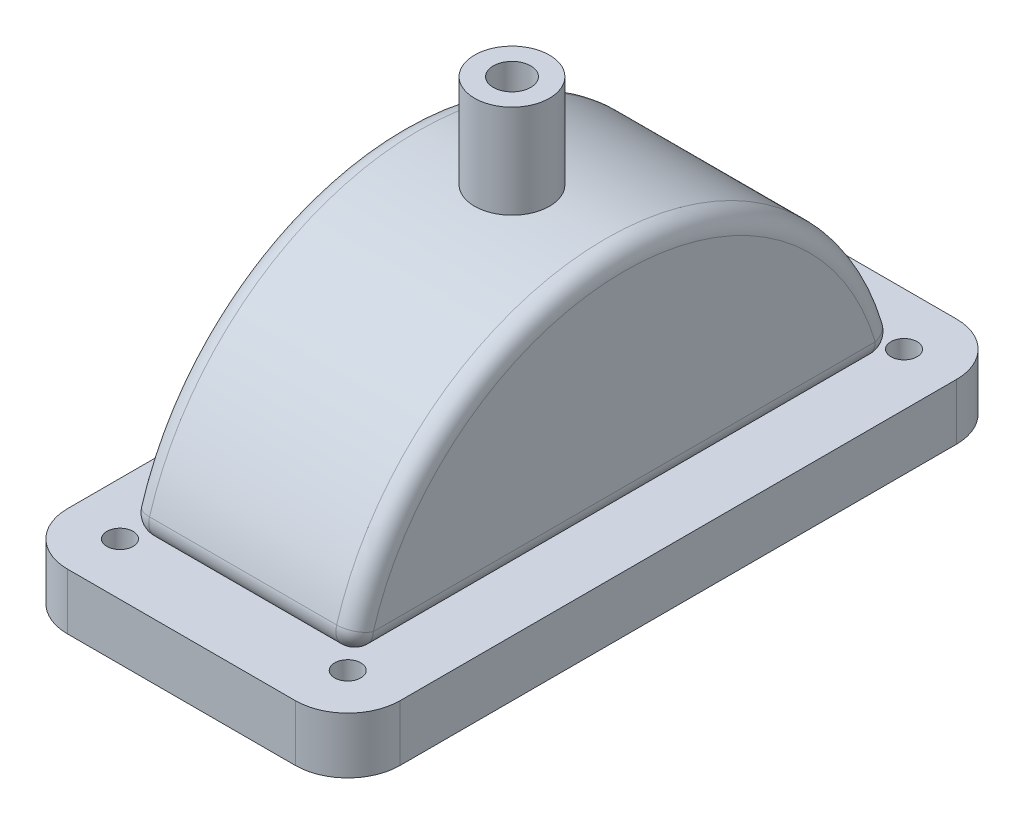
ISO-10303-21;
HEADER;
FILE_DESCRIPTION(('STEP AP214'),'2;1');
FILE_NAME('part.step','',(''),(''),'','','');
FILE_SCHEMA(('AUTOMOTIVE_DESIGN { 1 0 10303 214 1 1 1 1 }'));
ENDSEC;
DATA;
#1=APPLICATION_CONTEXT('core data for automotive mechanical design processes');
#2=APPLICATION_PROTOCOL_DEFINITION('international standard','automotive_design',2000,#1);
#3=PRODUCT_CONTEXT('',#1,'mechanical');
#4=PRODUCT('Part','Part','',(#3));
#5=PRODUCT_RELATED_PRODUCT_CATEGORY('part','',(#4));
#6=PRODUCT_DEFINITION_FORMATION('','',#4);
#7=PRODUCT_DEFINITION_CONTEXT('part definition',#1,'design');
#8=PRODUCT_DEFINITION('design','',#6,#7);
#9=PRODUCT_DEFINITION_SHAPE('','',#8);
#10=(LENGTH_UNIT() NAMED_UNIT(*) SI_UNIT(.MILLI.,.METRE.));
#11=(NAMED_UNIT(*) PLANE_ANGLE_UNIT() SI_UNIT($,.RADIAN.));
#12=(NAMED_UNIT(*) SI_UNIT($,.STERADIAN.) SOLID_ANGLE_UNIT());
#13=UNCERTAINTY_MEASURE_WITH_UNIT(LENGTH_MEASURE(1.E-05),#10,'distance_accuracy_value','');
#14=(GEOMETRIC_REPRESENTATION_CONTEXT(3) GLOBAL_UNCERTAINTY_ASSIGNED_CONTEXT((#13)) GLOBAL_UNIT_ASSIGNED_CONTEXT((#10,
#11,#12)) REPRESENTATION_CONTEXT('',''));
#15=CARTESIAN_POINT('',(0.,0.,0.));
#16=DIRECTION('',(0.,0.,1.));
#17=DIRECTION('',(1.,0.,0.));
#18=AXIS2_PLACEMENT_3D('',#15,#16,#17);
#19=CARTESIAN_POINT('',(0.,200.,0.));
#20=DIRECTION('',(0.,-1.,0.));
#21=DIRECTION('',(0.,0.,-1.));
#22=AXIS2_PLACEMENT_3D('',#19,#20,#21);
#23=CYLINDRICAL_SURFACE('',#22,20.);
#24=CARTESIAN_POINT('',(0.,200.,0.));
#25=DIRECTION('',(0.,1.,0.));
#26=DIRECTION('',(0.,0.,1.));
#27=AXIS2_PLACEMENT_3D('',#24,#25,#26);
#28=CIRCLE('',#27,20.);
#29=CARTESIAN_POINT('',(0.,200.,20.));
#30=VERTEX_POINT('',#29);
#31=EDGE_CURVE('E11',#30,#30,#28,.T.);
#32=ORIENTED_EDGE('',*,*,#31,.F.);
#33=EDGE_LOOP('',(#32));
#34=FACE_BOUND('',#33,.T.);
#35=CARTESIAN_POINT('',(0.,150.,0.));
#36=DIRECTION('',(0.,1.,0.));
#37=DIRECTION('',(0.,0.,1.));
#38=AXIS2_PLACEMENT_3D('',#35,#36,#37);
#39=CIRCLE('',#38,20.);
#40=CARTESIAN_POINT('',(0.,150.,20.));
#41=VERTEX_POINT('',#40);
#42=EDGE_CURVE('E57',#41,#41,#39,.T.);
#43=ORIENTED_EDGE('',*,*,#42,.T.);
#44=EDGE_LOOP('',(#43));
#45=FACE_BOUND('',#44,.T.);
#46=ADVANCED_FACE('F54',(#34,#45),#23,.T.);
#47=CARTESIAN_POINT('',(0.,200.,0.));
#48=DIRECTION('',(0.,1.,0.));
#49=DIRECTION('',(0.,0.,1.));
#50=AXIS2_PLACEMENT_3D('',#47,#48,#49);
#51=PLANE('',#50);
#52=CARTESIAN_POINT('',(0.,200.,0.));
#53=DIRECTION('',(0.,1.,0.));
#54=DIRECTION('',(0.,0.,1.));
#55=AXIS2_PLACEMENT_3D('',#52,#53,#54);
#56=CIRCLE('',#55,10.);
#57=CARTESIAN_POINT('',(0.,200.,10.));
#58=VERTEX_POINT('',#57);
#59=EDGE_CURVE('E68',#58,#58,#56,.T.);
#60=ORIENTED_EDGE('',*,*,#59,.F.);
#61=EDGE_LOOP('',(#60));
#62=FACE_BOUND('',#61,.T.);
#63=ORIENTED_EDGE('',*,*,#31,.T.);
#64=EDGE_LOOP('',(#63));
#65=FACE_BOUND('',#64,.T.);
#66=ADVANCED_FACE('F75',(#62,#65),#51,.T.);
#67=CARTESIAN_POINT('',(0.,150.,0.));
#68=DIRECTION('',(0.,1.,0.));
#69=DIRECTION('',(0.,0.,1.));
#70=AXIS2_PLACEMENT_3D('',#67,#68,#69);
#71=PLANE('',#70);
#72=CARTESIAN_POINT('',(0.,150.,0.));
#73=DIRECTION('',(0.,1.,0.));
#74=DIRECTION('',(0.,0.,1.));
#75=AXIS2_PLACEMENT_3D('',#72,#73,#74);
#76=CIRCLE('',#75,10.);
#77=CARTESIAN_POINT('',(0.,150.,10.));
#78=VERTEX_POINT('',#77);
#79=EDGE_CURVE('E64',#78,#78,#76,.F.);
#80=ORIENTED_EDGE('',*,*,#79,.F.);
#81=EDGE_LOOP('',(#80));
#82=FACE_BOUND('',#81,.T.);
#83=ORIENTED_EDGE('',*,*,#42,.F.);
#84=EDGE_LOOP('',(#83));
#85=FACE_BOUND('',#84,.T.);
#86=ADVANCED_FACE('F77',(#82,#85),#71,.F.);
#87=CARTESIAN_POINT('',(0.,-0.001000000000001,0.));
#88=DIRECTION('',(0.,1.,0.));
#89=DIRECTION('',(0.,0.,1.));
#90=AXIS2_PLACEMENT_3D('',#87,#88,#89);
#91=CYLINDRICAL_SURFACE('',#90,10.);
#92=CARTESIAN_POINT('',(0.,200.,10.));
#93=CARTESIAN_POINT('',(0.,199.479166666667,10.));
#94=CARTESIAN_POINT('',(0.,198.958333333333,10.));
#95=CARTESIAN_POINT('',(0.,197.916666666667,10.));
#96=CARTESIAN_POINT('',(0.,197.395833333333,10.));
#97=CARTESIAN_POINT('',(0.,196.354166666667,10.));
#98=CARTESIAN_POINT('',(0.,195.833333333333,10.));
#99=CARTESIAN_POINT('',(0.,194.791666666667,10.));
#100=CARTESIAN_POINT('',(0.,194.270833333333,10.));
#101=CARTESIAN_POINT('',(0.,193.229166666667,10.));
#102=CARTESIAN_POINT('',(0.,192.708333333333,10.));
#103=CARTESIAN_POINT('',(0.,191.666666666667,10.));
#104=CARTESIAN_POINT('',(0.,191.145833333333,10.));
#105=CARTESIAN_POINT('',(0.,190.104166666667,10.));
#106=CARTESIAN_POINT('',(0.,189.583333333333,10.));
#107=CARTESIAN_POINT('',(0.,188.541666666667,10.));
#108=CARTESIAN_POINT('',(0.,188.020833333333,10.));
#109=CARTESIAN_POINT('',(0.,186.979166666667,10.));
#110=CARTESIAN_POINT('',(0.,186.458333333333,10.));
#111=CARTESIAN_POINT('',(0.,185.416666666667,10.));
#112=CARTESIAN_POINT('',(0.,184.895833333333,10.));
#113=CARTESIAN_POINT('',(0.,183.854166666667,10.));
#114=CARTESIAN_POINT('',(0.,183.333333333333,10.));
#115=CARTESIAN_POINT('',(0.,182.291666666667,10.));
#116=CARTESIAN_POINT('',(0.,181.770833333333,10.));
#117=CARTESIAN_POINT('',(0.,180.729166666667,10.));
#118=CARTESIAN_POINT('',(0.,180.208333333333,10.));
#119=CARTESIAN_POINT('',(0.,179.166666666667,10.));
#120=CARTESIAN_POINT('',(0.,178.645833333333,10.));
#121=CARTESIAN_POINT('',(0.,177.604166666667,10.));
#122=CARTESIAN_POINT('',(0.,177.083333333333,10.));
#123=CARTESIAN_POINT('',(0.,176.041666666667,10.));
#124=CARTESIAN_POINT('',(0.,175.520833333333,10.));
#125=CARTESIAN_POINT('',(0.,174.479166666667,10.));
#126=CARTESIAN_POINT('',(0.,173.958333333333,10.));
#127=CARTESIAN_POINT('',(0.,172.916666666667,10.));
#128=CARTESIAN_POINT('',(0.,172.395833333333,10.));
#129=CARTESIAN_POINT('',(0.,171.354166666667,10.));
#130=CARTESIAN_POINT('',(0.,170.833333333333,10.));
#131=CARTESIAN_POINT('',(0.,169.791666666667,10.));
#132=CARTESIAN_POINT('',(0.,169.270833333333,10.));
#133=CARTESIAN_POINT('',(0.,168.229166666667,10.));
#134=CARTESIAN_POINT('',(0.,167.708333333333,10.));
#135=CARTESIAN_POINT('',(0.,166.666666666667,10.));
#136=CARTESIAN_POINT('',(0.,166.145833333333,10.));
#137=CARTESIAN_POINT('',(0.,165.104166666667,10.));
#138=CARTESIAN_POINT('',(0.,164.583333333333,10.));
#139=CARTESIAN_POINT('',(0.,163.541666666667,10.));
#140=CARTESIAN_POINT('',(0.,163.020833333333,10.));
#141=CARTESIAN_POINT('',(0.,161.979166666667,10.));
#142=CARTESIAN_POINT('',(0.,161.458333333333,10.));
#143=CARTESIAN_POINT('',(0.,160.416666666667,10.));
#144=CARTESIAN_POINT('',(0.,159.895833333333,10.));
#145=CARTESIAN_POINT('',(0.,158.854166666667,10.));
#146=CARTESIAN_POINT('',(0.,158.333333333333,10.));
#147=CARTESIAN_POINT('',(0.,157.291666666667,10.));
#148=CARTESIAN_POINT('',(0.,156.770833333333,10.));
#149=CARTESIAN_POINT('',(0.,155.729166666667,10.));
#150=CARTESIAN_POINT('',(0.,155.208333333333,10.));
#151=CARTESIAN_POINT('',(0.,154.166666666667,10.));
#152=CARTESIAN_POINT('',(0.,153.645833333333,10.));
#153=CARTESIAN_POINT('',(0.,152.604166666667,10.));
#154=CARTESIAN_POINT('',(0.,152.083333333333,10.));
#155=CARTESIAN_POINT('',(0.,151.041666666667,10.));
#156=CARTESIAN_POINT('',(0.,150.520833333333,10.));
#157=CARTESIAN_POINT('',(0.,150.,10.));
#158=B_SPLINE_CURVE_WITH_KNOTS('',3,(#92,#93,#94,#95,#96,#97,#98,#99,#100,#101,#102,#103,#104,
#105,#106,#107,#108,#109,#110,#111,#112,#113,#114,#115,#116,#117,#118,#119,#120,#121,#122,#123,
#124,#125,#126,#127,#128,#129,#130,#131,#132,#133,#134,#135,#136,#137,#138,#139,#140,#141,#142,
#143,#144,#145,#146,#147,#148,#149,#150,#151,#152,#153,#154,#155,#156,#157),.UNSPECIFIED.,.F.,
.F.,(4,2,2,2,2,2,2,2,2,2,2,2,2,2,2,2,2,2,2,2,2,2,2,2,2,2,2,2,2,2,2,2,4),(0.,1.56249999999999,
3.12499999999999,4.68750000000001,6.25000000000001,7.8125,9.37500000000002,10.9375,12.5,14.0625,
15.625,17.1875,18.75,20.3125,21.875,23.4375,25.,26.5625,28.125,29.6875,31.25,32.8125,34.375,
35.9375,37.5,39.0625,40.625,42.1875,43.75,45.3125,46.8750000000001,48.4375,50.),.UNSPECIFIED.);
#159=EDGE_CURVE('BSEAM72',#58,#78,#158,.T.);
#160=ORIENTED_EDGE('',*,*,#59,.T.);
#161=ORIENTED_EDGE('',*,*,#79,.T.);
#162=ORIENTED_EDGE('',*,*,#159,.T.);
#163=ORIENTED_EDGE('',*,*,#159,.F.);
#164=EDGE_LOOP('',(#160,#162,#161,#163));
#165=FACE_BOUND('',#164,.T.);
#166=ADVANCED_FACE('F72',(#165),#91,.F.);
#167=CLOSED_SHELL('',(#46,#66,#86,#166));
#168=MANIFOLD_SOLID_BREP('B2',#167);
#169=CARTESIAN_POINT('',(50.,0.,0.));
#170=DIRECTION('',(1.,0.,0.));
#171=DIRECTION('',(0.,0.,-1.));
#172=AXIS2_PLACEMENT_3D('',#169,#170,#171);
#173=TOROIDAL_SURFACE('',#172,140.,10.);
#174=CARTESIAN_POINT('',(50.,0.,0.));
#175=DIRECTION('',(1.,0.,0.));
#176=DIRECTION('',(0.,0.,-1.));
#177=AXIS2_PLACEMENT_3D('',#174,#175,#176);
#178=CIRCLE('',#177,150.);
#179=CARTESIAN_POINT('',(50.,43.1254606098727,143.666957395173));
#180=VERTEX_POINT('',#179);
#181=CARTESIAN_POINT('',(50.,43.1254606098727,-143.666957395173));
#182=VERTEX_POINT('',#181);
#183=EDGE_CURVE('E253',#180,#182,#178,.F.);
#184=ORIENTED_EDGE('',*,*,#183,.F.);
#185=CARTESIAN_POINT('',(50.,40.2504299025479,134.089160235494));
#186=DIRECTION('',(0.,-0.957779715967817,0.287503070732485));
#187=DIRECTION('',(0.,-0.287503070732485,-0.957779715967817));
#188=AXIS2_PLACEMENT_3D('',#185,#186,#187);
#189=CIRCLE('',#188,10.);
#190=CARTESIAN_POINT('',(60.,40.2504299025479,134.089160235494));
#191=VERTEX_POINT('',#190);
#192=EDGE_CURVE('E142',#180,#191,#189,.F.);
#193=ORIENTED_EDGE('',*,*,#192,.T.);
#194=CARTESIAN_POINT('',(60.,0.,0.));
#195=DIRECTION('',(1.,0.,0.));
#196=DIRECTION('',(0.,0.,-1.));
#197=AXIS2_PLACEMENT_3D('',#194,#195,#196);
#198=CIRCLE('',#197,140.);
#199=CARTESIAN_POINT('',(60.,40.2504299025479,-134.089160235494));
#200=VERTEX_POINT('',#199);
#201=EDGE_CURVE('E255',#200,#191,#198,.T.);
#202=ORIENTED_EDGE('',*,*,#201,.F.);
#203=CARTESIAN_POINT('',(50.,40.2504299025479,-134.089160235494));
#204=DIRECTION('',(0.,0.957779715967817,0.287503070732485));
#205=DIRECTION('',(0.,-0.287503070732485,0.957779715967817));
#206=AXIS2_PLACEMENT_3D('',#203,#204,#205);
#207=CIRCLE('',#206,10.);
#208=EDGE_CURVE('E238',#200,#182,#207,.T.);
#209=ORIENTED_EDGE('',*,*,#208,.T.);
#210=EDGE_LOOP('',(#184,#193,#202,#209));
#211=FACE_BOUND('',#210,.T.);
#212=ADVANCED_FACE('F125',(#211),#173,.T.);
#213=CARTESIAN_POINT('',(-50.,0.,0.));
#214=DIRECTION('',(1.,0.,0.));
#215=DIRECTION('',(0.,0.,-1.));
#216=AXIS2_PLACEMENT_3D('',#213,#214,#215);
#217=TOROIDAL_SURFACE('',#216,140.,10.);
#218=CARTESIAN_POINT('',(-60.,0.,0.));
#219=DIRECTION('',(1.,0.,0.));
#220=DIRECTION('',(0.,0.,-1.));
#221=AXIS2_PLACEMENT_3D('',#218,#219,#220);
#222=CIRCLE('',#221,140.);
#223=CARTESIAN_POINT('',(-60.,40.2504299025479,134.089160235494));
#224=VERTEX_POINT('',#223);
#225=CARTESIAN_POINT('',(-60.,40.2504299025479,-134.089160235494));
#226=VERTEX_POINT('',#225);
#227=EDGE_CURVE('E181',#224,#226,#222,.F.);
#228=ORIENTED_EDGE('',*,*,#227,.F.);
#229=CARTESIAN_POINT('',(-50.,40.2504299025479,134.089160235494));
#230=DIRECTION('',(0.,-0.957779715967817,0.287503070732485));
#231=DIRECTION('',(0.,-0.287503070732485,-0.957779715967817));
#232=AXIS2_PLACEMENT_3D('',#229,#230,#231);
#233=CIRCLE('',#232,10.);
#234=CARTESIAN_POINT('',(-50.,43.1254606098727,143.666957395173));
#235=VERTEX_POINT('',#234);
#236=EDGE_CURVE('E191',#224,#235,#233,.F.);
#237=ORIENTED_EDGE('',*,*,#236,.T.);
#238=CARTESIAN_POINT('',(-50.,0.,0.));
#239=DIRECTION('',(1.,0.,0.));
#240=DIRECTION('',(0.,0.,-1.));
#241=AXIS2_PLACEMENT_3D('',#238,#239,#240);
#242=CIRCLE('',#241,150.);
#243=CARTESIAN_POINT('',(-50.,43.1254606098727,-143.666957395173));
#244=VERTEX_POINT('',#243);
#245=EDGE_CURVE('E195',#244,#235,#242,.T.);
#246=ORIENTED_EDGE('',*,*,#245,.F.);
#247=CARTESIAN_POINT('',(-50.,40.2504299025479,-134.089160235494));
#248=DIRECTION('',(0.,0.957779715967817,0.287503070732485));
#249=DIRECTION('',(0.,-0.287503070732485,0.957779715967817));
#250=AXIS2_PLACEMENT_3D('',#247,#248,#249);
#251=CIRCLE('',#250,10.);
#252=EDGE_CURVE('E194',#244,#226,#251,.T.);
#253=ORIENTED_EDGE('',*,*,#252,.T.);
#254=EDGE_LOOP('',(#228,#237,#246,#253));
#255=FACE_BOUND('',#254,.T.);
#256=ADVANCED_FACE('F189',(#255),#217,.T.);
#257=CARTESIAN_POINT('',(-60.,30.2504299025479,0.));
#258=DIRECTION('',(0.,-1.,0.));
#259=DIRECTION('',(0.,0.,-1.));
#260=AXIS2_PLACEMENT_3D('',#257,#258,#259);
#261=PLANE('',#260);
#262=DIRECTION('',(0.,0.,-1.));
#263=VECTOR('',#262,1.);
#264=CARTESIAN_POINT('',(50.,30.2504299025479,0.));
#265=LINE('',#264,#263);
#266=CARTESIAN_POINT('',(50.,30.2504299025479,-134.089160235494));
#267=VERTEX_POINT('',#266);
#268=CARTESIAN_POINT('',(50.,30.2504299025479,134.089160235494));
#269=VERTEX_POINT('',#268);
#270=EDGE_CURVE('E235',#267,#269,#265,.F.);
#271=ORIENTED_EDGE('',*,*,#270,.T.);
#272=DIRECTION('',(1.,0.,0.));
#273=VECTOR('',#272,1.);
#274=CARTESIAN_POINT('',(-60.,30.2504299025479,134.089160235494));
#275=LINE('',#274,#273);
#276=CARTESIAN_POINT('',(-50.,30.2504299025479,134.089160235494));
#277=VERTEX_POINT('',#276);
#278=EDGE_CURVE('E240',#269,#277,#275,.F.);
#279=ORIENTED_EDGE('',*,*,#278,.T.);
#280=DIRECTION('',(0.,0.,-1.));
#281=VECTOR('',#280,1.);
#282=CARTESIAN_POINT('',(-50.,30.2504299025479,-136.692763124867));
#283=LINE('',#282,#281);
#284=CARTESIAN_POINT('',(-50.,30.2504299025479,-134.089160235494));
#285=VERTEX_POINT('',#284);
#286=EDGE_CURVE('E207',#277,#285,#283,.T.);
#287=ORIENTED_EDGE('',*,*,#286,.T.);
#288=DIRECTION('',(1.,0.,0.));
#289=VECTOR('',#288,1.);
#290=CARTESIAN_POINT('',(-60.,30.2504299025479,-134.089160235494));
#291=LINE('',#290,#289);
#292=EDGE_CURVE('E246',#285,#267,#291,.T.);
#293=ORIENTED_EDGE('',*,*,#292,.T.);
#294=EDGE_LOOP('',(#271,#279,#287,#293));
#295=FACE_BOUND('',#294,.T.);
#296=ADVANCED_FACE('F280',(#295),#261,.T.);
#297=CARTESIAN_POINT('',(-60.,0.,0.));
#298=DIRECTION('',(1.,0.,0.));
#299=DIRECTION('',(0.,0.,-1.));
#300=AXIS2_PLACEMENT_3D('',#297,#298,#299);
#301=CYLINDRICAL_SURFACE('',#300,150.);
#302=ORIENTED_EDGE('',*,*,#245,.T.);
#303=DIRECTION('',(1.,0.,0.));
#304=VECTOR('',#303,1.);
#305=CARTESIAN_POINT('',(-60.,43.1254606098727,143.666957395173));
#306=LINE('',#305,#304);
#307=EDGE_CURVE('E249',#235,#180,#306,.T.);
#308=ORIENTED_EDGE('',*,*,#307,.T.);
#309=ORIENTED_EDGE('',*,*,#183,.T.);
#310=DIRECTION('',(1.,0.,0.));
#311=VECTOR('',#310,1.);
#312=CARTESIAN_POINT('',(-60.,43.1254606098727,-143.666957395173));
#313=LINE('',#312,#311);
#314=EDGE_CURVE('E203',#182,#244,#313,.F.);
#315=ORIENTED_EDGE('',*,*,#314,.T.);
#316=EDGE_LOOP('',(#302,#308,#309,#315));
#317=FACE_BOUND('',#316,.T.);
#318=ADVANCED_FACE('F258',(#317),#301,.T.);
#319=CARTESIAN_POINT('',(-60.,0.,0.));
#320=DIRECTION('',(1.,0.,0.));
#321=DIRECTION('',(0.,0.,-1.));
#322=AXIS2_PLACEMENT_3D('',#319,#320,#321);
#323=PLANE('',#322);
#324=ORIENTED_EDGE('',*,*,#227,.T.);
#325=DIRECTION('',(0.,0.,-1.));
#326=VECTOR('',#325,1.);
#327=CARTESIAN_POINT('',(-60.,40.2504299025479,136.692763124867));
#328=LINE('',#327,#326);
#329=EDGE_CURVE('E52',#226,#224,#328,.F.);
#330=ORIENTED_EDGE('',*,*,#329,.T.);
#331=EDGE_LOOP('',(#324,#330));
#332=FACE_BOUND('',#331,.T.);
#333=ADVANCED_FACE('F180',(#332),#323,.F.);
#334=CARTESIAN_POINT('',(60.,0.,0.));
#335=DIRECTION('',(1.,0.,0.));
#336=DIRECTION('',(0.,0.,-1.));
#337=AXIS2_PLACEMENT_3D('',#334,#335,#336);
#338=PLANE('',#337);
#339=ORIENTED_EDGE('',*,*,#201,.T.);
#340=DIRECTION('',(0.,0.,-1.));
#341=VECTOR('',#340,1.);
#342=CARTESIAN_POINT('',(60.,40.2504299025479,0.));
#343=LINE('',#342,#341);
#344=EDGE_CURVE('E134',#191,#200,#343,.T.);
#345=ORIENTED_EDGE('',*,*,#344,.T.);
#346=EDGE_LOOP('',(#339,#345));
#347=FACE_BOUND('',#346,.T.);
#348=ADVANCED_FACE('F339',(#347),#338,.T.);
#349=CARTESIAN_POINT('',(50.,40.2504299025479,-134.089160235494));
#350=DIRECTION('',(0.,-1.,0.));
#351=DIRECTION('',(0.,0.,-1.));
#352=AXIS2_PLACEMENT_3D('',#349,#350,#351);
#353=SPHERICAL_SURFACE('',#352,10.);
#354=CARTESIAN_POINT('',(50.,40.2504299025479,-134.089160235494));
#355=DIRECTION('',(-1.,0.,0.));
#356=DIRECTION('',(0.,0.,1.));
#357=AXIS2_PLACEMENT_3D('',#354,#355,#356);
#358=CIRCLE('',#357,10.);
#359=EDGE_CURVE('E223',#182,#267,#358,.T.);
#360=ORIENTED_EDGE('',*,*,#359,.F.);
#361=ORIENTED_EDGE('',*,*,#208,.F.);
#362=CARTESIAN_POINT('',(50.,40.2504299025479,-134.089160235494));
#363=DIRECTION('',(0.,0.,1.));
#364=DIRECTION('',(1.,0.,0.));
#365=AXIS2_PLACEMENT_3D('',#362,#363,#364);
#366=CIRCLE('',#365,10.);
#367=EDGE_CURVE('E129',#267,#200,#366,.T.);
#368=ORIENTED_EDGE('',*,*,#367,.F.);
#369=EDGE_LOOP('',(#360,#361,#368));
#370=FACE_BOUND('',#369,.T.);
#371=ADVANCED_FACE('F127',(#370),#353,.T.);
#372=CARTESIAN_POINT('',(50.,40.2504299025479,0.));
#373=DIRECTION('',(0.,0.,-1.));
#374=DIRECTION('',(-1.,0.,0.));
#375=AXIS2_PLACEMENT_3D('',#372,#373,#374);
#376=CYLINDRICAL_SURFACE('',#375,10.);
#377=ORIENTED_EDGE('',*,*,#367,.T.);
#378=ORIENTED_EDGE('',*,*,#344,.F.);
#379=CARTESIAN_POINT('',(50.,40.2504299025479,134.089160235494));
#380=DIRECTION('',(0.,0.,1.));
#381=DIRECTION('',(1.,0.,0.));
#382=AXIS2_PLACEMENT_3D('',#379,#380,#381);
#383=CIRCLE('',#382,10.);
#384=EDGE_CURVE('E221',#269,#191,#383,.T.);
#385=ORIENTED_EDGE('',*,*,#384,.F.);
#386=ORIENTED_EDGE('',*,*,#270,.F.);
#387=EDGE_LOOP('',(#377,#378,#385,#386));
#388=FACE_BOUND('',#387,.T.);
#389=ADVANCED_FACE('F233',(#388),#376,.T.);
#390=CARTESIAN_POINT('',(-60.,40.2504299025479,-134.089160235494));
#391=DIRECTION('',(1.,0.,0.));
#392=DIRECTION('',(0.,0.,-1.));
#393=AXIS2_PLACEMENT_3D('',#390,#391,#392);
#394=CYLINDRICAL_SURFACE('',#393,10.);
#395=ORIENTED_EDGE('',*,*,#359,.T.);
#396=ORIENTED_EDGE('',*,*,#292,.F.);
#397=CARTESIAN_POINT('',(-50.,40.2504299025479,-134.089160235494));
#398=DIRECTION('',(-1.,0.,0.));
#399=DIRECTION('',(0.,0.,1.));
#400=AXIS2_PLACEMENT_3D('',#397,#398,#399);
#401=CIRCLE('',#400,10.);
#402=EDGE_CURVE('E218',#244,#285,#401,.T.);
#403=ORIENTED_EDGE('',*,*,#402,.F.);
#404=ORIENTED_EDGE('',*,*,#314,.F.);
#405=EDGE_LOOP('',(#395,#396,#403,#404));
#406=FACE_BOUND('',#405,.T.);
#407=ADVANCED_FACE('F260',(#406),#394,.T.);
#408=CARTESIAN_POINT('',(50.,40.2504299025479,134.089160235494));
#409=DIRECTION('',(0.,-1.,0.));
#410=DIRECTION('',(0.,0.,-1.));
#411=AXIS2_PLACEMENT_3D('',#408,#409,#410);
#412=SPHERICAL_SURFACE('',#411,10.);
#413=ORIENTED_EDGE('',*,*,#384,.T.);
#414=ORIENTED_EDGE('',*,*,#192,.F.);
#415=CARTESIAN_POINT('',(50.,40.2504299025479,134.089160235494));
#416=DIRECTION('',(-1.,0.,0.));
#417=DIRECTION('',(0.,0.,1.));
#418=AXIS2_PLACEMENT_3D('',#415,#416,#417);
#419=CIRCLE('',#418,10.);
#420=EDGE_CURVE('E215',#269,#180,#419,.T.);
#421=ORIENTED_EDGE('',*,*,#420,.F.);
#422=EDGE_LOOP('',(#413,#414,#421));
#423=FACE_BOUND('',#422,.T.);
#424=ADVANCED_FACE('F265',(#423),#412,.T.);
#425=CARTESIAN_POINT('',(-50.,40.2504299025479,-134.089160235494));
#426=DIRECTION('',(0.,-1.,0.));
#427=DIRECTION('',(0.,0.,-1.));
#428=AXIS2_PLACEMENT_3D('',#425,#426,#427);
#429=SPHERICAL_SURFACE('',#428,10.);
#430=ORIENTED_EDGE('',*,*,#252,.F.);
#431=ORIENTED_EDGE('',*,*,#402,.T.);
#432=CARTESIAN_POINT('',(-50.,40.2504299025479,-134.089160235494));
#433=DIRECTION('',(0.,0.,1.));
#434=DIRECTION('',(1.,0.,0.));
#435=AXIS2_PLACEMENT_3D('',#432,#433,#434);
#436=CIRCLE('',#435,10.);
#437=EDGE_CURVE('E210',#226,#285,#436,.T.);
#438=ORIENTED_EDGE('',*,*,#437,.F.);
#439=EDGE_LOOP('',(#430,#431,#438));
#440=FACE_BOUND('',#439,.T.);
#441=ADVANCED_FACE('F262',(#440),#429,.T.);
#442=CARTESIAN_POINT('',(-60.,40.2504299025479,134.089160235494));
#443=DIRECTION('',(1.,0.,0.));
#444=DIRECTION('',(0.,0.,-1.));
#445=AXIS2_PLACEMENT_3D('',#442,#443,#444);
#446=CYLINDRICAL_SURFACE('',#445,10.);
#447=ORIENTED_EDGE('',*,*,#420,.T.);
#448=ORIENTED_EDGE('',*,*,#307,.F.);
#449=CARTESIAN_POINT('',(-50.,40.2504299025479,134.089160235494));
#450=DIRECTION('',(-1.,0.,0.));
#451=DIRECTION('',(0.,0.,1.));
#452=AXIS2_PLACEMENT_3D('',#449,#450,#451);
#453=CIRCLE('',#452,10.);
#454=EDGE_CURVE('E201',#277,#235,#453,.T.);
#455=ORIENTED_EDGE('',*,*,#454,.F.);
#456=ORIENTED_EDGE('',*,*,#278,.F.);
#457=EDGE_LOOP('',(#447,#448,#455,#456));
#458=FACE_BOUND('',#457,.T.);
#459=ADVANCED_FACE('F264',(#458),#446,.T.);
#460=CARTESIAN_POINT('',(-50.,40.2504299025479,0.));
#461=DIRECTION('',(0.,0.,1.));
#462=DIRECTION('',(1.,0.,0.));
#463=AXIS2_PLACEMENT_3D('',#460,#461,#462);
#464=CYLINDRICAL_SURFACE('',#463,10.);
#465=ORIENTED_EDGE('',*,*,#437,.T.);
#466=ORIENTED_EDGE('',*,*,#286,.F.);
#467=CARTESIAN_POINT('',(-50.,40.2504299025479,134.089160235494));
#468=DIRECTION('',(0.,0.,1.));
#469=DIRECTION('',(0.,-1.,0.));
#470=AXIS2_PLACEMENT_3D('',#467,#468,#469);
#471=CIRCLE('',#470,10.);
#472=EDGE_CURVE('E199',#224,#277,#471,.T.);
#473=ORIENTED_EDGE('',*,*,#472,.F.);
#474=ORIENTED_EDGE('',*,*,#329,.F.);
#475=EDGE_LOOP('',(#465,#466,#473,#474));
#476=FACE_BOUND('',#475,.T.);
#477=ADVANCED_FACE('F206',(#476),#464,.T.);
#478=CARTESIAN_POINT('',(-50.,40.2504299025479,134.089160235494));
#479=DIRECTION('',(0.,-1.,0.));
#480=DIRECTION('',(0.,0.,-1.));
#481=AXIS2_PLACEMENT_3D('',#478,#479,#480);
#482=SPHERICAL_SURFACE('',#481,10.);
#483=ORIENTED_EDGE('',*,*,#454,.T.);
#484=ORIENTED_EDGE('',*,*,#236,.F.);
#485=ORIENTED_EDGE('',*,*,#472,.T.);
#486=EDGE_LOOP('',(#483,#484,#485));
#487=FACE_BOUND('',#486,.T.);
#488=ADVANCED_FACE('F198',(#487),#482,.T.);
#489=CLOSED_SHELL('',(#212,#256,#296,#318,#333,#348,#371,#389,#407,#424,#441,#459,#477,#488));
#490=MANIFOLD_SOLID_BREP('B6',#489);
#491=CARTESIAN_POINT('',(-60.845,30.,148.61));
#492=DIRECTION('',(0.,-1.,0.));
#493=DIRECTION('',(0.,0.,-1.));
#494=AXIS2_PLACEMENT_3D('',#491,#492,#493);
#495=CYLINDRICAL_SURFACE('',#494,28.);
#496=CARTESIAN_POINT('',(-60.845,0.,148.61));
#497=DIRECTION('',(0.,1.,0.));
#498=DIRECTION('',(0.,0.,1.));
#499=AXIS2_PLACEMENT_3D('',#496,#497,#498);
#500=CIRCLE('',#499,28.);
#501=CARTESIAN_POINT('',(-88.8450000000001,0.,148.61));
#502=VERTEX_POINT('',#501);
#503=CARTESIAN_POINT('',(-60.845,0.,176.61));
#504=VERTEX_POINT('',#503);
#505=EDGE_CURVE('E492',#502,#504,#500,.T.);
#506=ORIENTED_EDGE('',*,*,#505,.T.);
#507=DIRECTION('',(0.,-1.,0.));
#508=VECTOR('',#507,1.);
#509=CARTESIAN_POINT('',(-60.845,30.,176.61));
#510=LINE('',#509,#508);
#511=CARTESIAN_POINT('',(-60.845,30.,176.61));
#512=VERTEX_POINT('',#511);
#513=EDGE_CURVE('E123',#512,#504,#510,.T.);
#514=ORIENTED_EDGE('',*,*,#513,.F.);
#515=CARTESIAN_POINT('',(-60.845,30.,148.61));
#516=DIRECTION('',(0.,1.,0.));
#517=DIRECTION('',(0.,0.,1.));
#518=AXIS2_PLACEMENT_3D('',#515,#516,#517);
#519=CIRCLE('',#518,28.);
#520=CARTESIAN_POINT('',(-88.8450000000001,30.,148.61));
#521=VERTEX_POINT('',#520);
#522=EDGE_CURVE('E507',#521,#512,#519,.T.);
#523=ORIENTED_EDGE('',*,*,#522,.F.);
#524=DIRECTION('',(0.,-1.,0.));
#525=VECTOR('',#524,1.);
#526=CARTESIAN_POINT('',(-88.8450000000001,30.,148.61));
#527=LINE('',#526,#525);
#528=EDGE_CURVE('E488',#521,#502,#527,.T.);
#529=ORIENTED_EDGE('',*,*,#528,.T.);
#530=EDGE_LOOP('',(#506,#514,#523,#529));
#531=FACE_BOUND('',#530,.T.);
#532=ADVANCED_FACE('F396',(#531),#495,.T.);
#533=CARTESIAN_POINT('',(-60.845,30.,176.61));
#534=DIRECTION('',(0.,0.,-1.));
#535=DIRECTION('',(-1.,0.,0.));
#536=AXIS2_PLACEMENT_3D('',#533,#534,#535);
#537=PLANE('',#536);
#538=DIRECTION('',(1.,0.,0.));
#539=VECTOR('',#538,1.);
#540=CARTESIAN_POINT('',(-60.845,0.,176.61));
#541=LINE('',#540,#539);
#542=CARTESIAN_POINT('',(60.845,0.,176.61));
#543=VERTEX_POINT('',#542);
#544=EDGE_CURVE('E495',#504,#543,#541,.T.);
#545=ORIENTED_EDGE('',*,*,#544,.T.);
#546=DIRECTION('',(0.,-1.,0.));
#547=VECTOR('',#546,1.);
#548=CARTESIAN_POINT('',(60.845,30.,176.61));
#549=LINE('',#548,#547);
#550=CARTESIAN_POINT('',(60.845,30.,176.61));
#551=VERTEX_POINT('',#550);
#552=EDGE_CURVE('E404',#551,#543,#549,.T.);
#553=ORIENTED_EDGE('',*,*,#552,.F.);
#554=DIRECTION('',(1.,0.,0.));
#555=VECTOR('',#554,1.);
#556=CARTESIAN_POINT('',(-60.845,30.,176.61));
#557=LINE('',#556,#555);
#558=EDGE_CURVE('E455',#512,#551,#557,.T.);
#559=ORIENTED_EDGE('',*,*,#558,.F.);
#560=ORIENTED_EDGE('',*,*,#513,.T.);
#561=EDGE_LOOP('',(#545,#553,#559,#560));
#562=FACE_BOUND('',#561,.T.);
#563=ADVANCED_FACE('F594',(#562),#537,.F.);
#564=CARTESIAN_POINT('',(60.8450000000001,30.,148.61));
#565=DIRECTION('',(0.,-1.,0.));
#566=DIRECTION('',(0.,0.,-1.));
#567=AXIS2_PLACEMENT_3D('',#564,#565,#566);
#568=CYLINDRICAL_SURFACE('',#567,27.9999999999998);
#569=CARTESIAN_POINT('',(60.8450000000001,0.,148.61));
#570=DIRECTION('',(0.,1.,0.));
#571=DIRECTION('',(0.,0.,-1.));
#572=AXIS2_PLACEMENT_3D('',#569,#570,#571);
#573=CIRCLE('',#572,27.9999999999998);
#574=CARTESIAN_POINT('',(88.845,0.,148.61));
#575=VERTEX_POINT('',#574);
#576=EDGE_CURVE('E498',#543,#575,#573,.T.);
#577=ORIENTED_EDGE('',*,*,#576,.T.);
#578=DIRECTION('',(0.,-1.,0.));
#579=VECTOR('',#578,1.);
#580=CARTESIAN_POINT('',(88.845,30.,148.61));
#581=LINE('',#580,#579);
#582=CARTESIAN_POINT('',(88.845,30.,148.61));
#583=VERTEX_POINT('',#582);
#584=EDGE_CURVE('E514',#583,#575,#581,.T.);
#585=ORIENTED_EDGE('',*,*,#584,.F.);
#586=CARTESIAN_POINT('',(60.8450000000001,30.,148.61));
#587=DIRECTION('',(0.,1.,0.));
#588=DIRECTION('',(0.,0.,-1.));
#589=AXIS2_PLACEMENT_3D('',#586,#587,#588);
#590=CIRCLE('',#589,27.9999999999998);
#591=EDGE_CURVE('E522',#551,#583,#590,.T.);
#592=ORIENTED_EDGE('',*,*,#591,.F.);
#593=ORIENTED_EDGE('',*,*,#552,.T.);
#594=EDGE_LOOP('',(#577,#585,#592,#593));
#595=FACE_BOUND('',#594,.T.);
#596=ADVANCED_FACE('F520',(#595),#568,.T.);
#597=CARTESIAN_POINT('',(88.845,30.,148.61));
#598=DIRECTION('',(-1.,0.,0.));
#599=DIRECTION('',(0.,0.,1.));
#600=AXIS2_PLACEMENT_3D('',#597,#598,#599);
#601=PLANE('',#600);
#602=DIRECTION('',(0.,0.,-1.));
#603=VECTOR('',#602,1.);
#604=CARTESIAN_POINT('',(88.845,0.,148.61));
#605=LINE('',#604,#603);
#606=CARTESIAN_POINT('',(88.845,0.,-148.61));
#607=VERTEX_POINT('',#606);
#608=EDGE_CURVE('E500',#575,#607,#605,.T.);
#609=ORIENTED_EDGE('',*,*,#608,.T.);
#610=DIRECTION('',(0.,-1.,0.));
#611=VECTOR('',#610,1.);
#612=CARTESIAN_POINT('',(88.845,30.,-148.61));
#613=LINE('',#612,#611);
#614=CARTESIAN_POINT('',(88.845,30.,-148.61));
#615=VERTEX_POINT('',#614);
#616=EDGE_CURVE('E511',#615,#607,#613,.T.);
#617=ORIENTED_EDGE('',*,*,#616,.F.);
#618=DIRECTION('',(0.,0.,-1.));
#619=VECTOR('',#618,1.);
#620=CARTESIAN_POINT('',(88.845,30.,148.61));
#621=LINE('',#620,#619);
#622=EDGE_CURVE('E534',#583,#615,#621,.T.);
#623=ORIENTED_EDGE('',*,*,#622,.F.);
#624=ORIENTED_EDGE('',*,*,#584,.T.);
#625=EDGE_LOOP('',(#609,#617,#623,#624));
#626=FACE_BOUND('',#625,.T.);
#627=ADVANCED_FACE('F530',(#626),#601,.F.);
#628=CARTESIAN_POINT('',(60.8450000000001,30.,-148.61));
#629=DIRECTION('',(0.,-1.,0.));
#630=DIRECTION('',(0.,0.,-1.));
#631=AXIS2_PLACEMENT_3D('',#628,#629,#630);
#632=CYLINDRICAL_SURFACE('',#631,27.9999999999998);
#633=CARTESIAN_POINT('',(60.8450000000001,0.,-148.61));
#634=DIRECTION('',(0.,1.,0.));
#635=DIRECTION('',(0.,0.,-1.));
#636=AXIS2_PLACEMENT_3D('',#633,#634,#635);
#637=CIRCLE('',#636,27.9999999999998);
#638=CARTESIAN_POINT('',(60.845,0.,-176.61));
#639=VERTEX_POINT('',#638);
#640=EDGE_CURVE('E502',#607,#639,#637,.T.);
#641=ORIENTED_EDGE('',*,*,#640,.T.);
#642=DIRECTION('',(0.,-1.,0.));
#643=VECTOR('',#642,1.);
#644=CARTESIAN_POINT('',(60.845,30.,-176.61));
#645=LINE('',#644,#643);
#646=CARTESIAN_POINT('',(60.845,30.,-176.61));
#647=VERTEX_POINT('',#646);
#648=EDGE_CURVE('E483',#647,#639,#645,.T.);
#649=ORIENTED_EDGE('',*,*,#648,.F.);
#650=CARTESIAN_POINT('',(60.8450000000001,30.,-148.61));
#651=DIRECTION('',(0.,1.,0.));
#652=DIRECTION('',(0.,0.,-1.));
#653=AXIS2_PLACEMENT_3D('',#650,#651,#652);
#654=CIRCLE('',#653,27.9999999999998);
#655=EDGE_CURVE('E474',#615,#647,#654,.T.);
#656=ORIENTED_EDGE('',*,*,#655,.F.);
#657=ORIENTED_EDGE('',*,*,#616,.T.);
#658=EDGE_LOOP('',(#641,#649,#656,#657));
#659=FACE_BOUND('',#658,.T.);
#660=ADVANCED_FACE('F533',(#659),#632,.T.);
#661=CARTESIAN_POINT('',(-60.845,30.,-176.61));
#662=DIRECTION('',(0.,0.,1.));
#663=DIRECTION('',(1.,0.,0.));
#664=AXIS2_PLACEMENT_3D('',#661,#662,#663);
#665=PLANE('',#664);
#666=DIRECTION('',(-1.,0.,0.));
#667=VECTOR('',#666,1.);
#668=CARTESIAN_POINT('',(-60.845,0.,-176.61));
#669=LINE('',#668,#667);
#670=CARTESIAN_POINT('',(-60.845,0.,-176.61));
#671=VERTEX_POINT('',#670);
#672=EDGE_CURVE('E482',#639,#671,#669,.T.);
#673=ORIENTED_EDGE('',*,*,#672,.T.);
#674=DIRECTION('',(0.,-1.,0.));
#675=VECTOR('',#674,1.);
#676=CARTESIAN_POINT('',(-60.845,30.,-176.61));
#677=LINE('',#676,#675);
#678=CARTESIAN_POINT('',(-60.845,30.,-176.61));
#679=VERTEX_POINT('',#678);
#680=EDGE_CURVE('E479',#679,#671,#677,.T.);
#681=ORIENTED_EDGE('',*,*,#680,.F.);
#682=DIRECTION('',(-1.,0.,0.));
#683=VECTOR('',#682,1.);
#684=CARTESIAN_POINT('',(-60.845,30.,-176.61));
#685=LINE('',#684,#683);
#686=EDGE_CURVE('E468',#647,#679,#685,.T.);
#687=ORIENTED_EDGE('',*,*,#686,.F.);
#688=ORIENTED_EDGE('',*,*,#648,.T.);
#689=EDGE_LOOP('',(#673,#681,#687,#688));
#690=FACE_BOUND('',#689,.T.);
#691=ADVANCED_FACE('F480',(#690),#665,.F.);
#692=CARTESIAN_POINT('',(-60.8450000000001,30.,-148.61));
#693=DIRECTION('',(0.,-1.,0.));
#694=DIRECTION('',(0.,0.,-1.));
#695=AXIS2_PLACEMENT_3D('',#692,#693,#694);
#696=CYLINDRICAL_SURFACE('',#695,28.);
#697=CARTESIAN_POINT('',(-60.8450000000001,0.,-148.61));
#698=DIRECTION('',(0.,1.,0.));
#699=DIRECTION('',(0.,0.,1.));
#700=AXIS2_PLACEMENT_3D('',#697,#698,#699);
#701=CIRCLE('',#700,28.);
#702=CARTESIAN_POINT('',(-88.8450000000001,0.,-148.61));
#703=VERTEX_POINT('',#702);
#704=EDGE_CURVE('E441',#671,#703,#701,.T.);
#705=ORIENTED_EDGE('',*,*,#704,.T.);
#706=DIRECTION('',(0.,-1.,0.));
#707=VECTOR('',#706,1.);
#708=CARTESIAN_POINT('',(-88.8450000000001,30.,-148.61));
#709=LINE('',#708,#707);
#710=CARTESIAN_POINT('',(-88.8450000000001,30.,-148.61));
#711=VERTEX_POINT('',#710);
#712=EDGE_CURVE('E484',#711,#703,#709,.T.);
#713=ORIENTED_EDGE('',*,*,#712,.F.);
#714=CARTESIAN_POINT('',(-60.8450000000001,30.,-148.61));
#715=DIRECTION('',(0.,1.,0.));
#716=DIRECTION('',(0.,0.,1.));
#717=AXIS2_PLACEMENT_3D('',#714,#715,#716);
#718=CIRCLE('',#717,28.);
#719=EDGE_CURVE('E472',#679,#711,#718,.T.);
#720=ORIENTED_EDGE('',*,*,#719,.F.);
#721=ORIENTED_EDGE('',*,*,#680,.T.);
#722=EDGE_LOOP('',(#705,#713,#720,#721));
#723=FACE_BOUND('',#722,.T.);
#724=ADVANCED_FACE('F486',(#723),#696,.T.);
#725=CARTESIAN_POINT('',(-88.8450000000001,30.,148.61));
#726=DIRECTION('',(1.,0.,0.));
#727=DIRECTION('',(0.,0.,-1.));
#728=AXIS2_PLACEMENT_3D('',#725,#726,#727);
#729=PLANE('',#728);
#730=DIRECTION('',(0.,0.,1.));
#731=VECTOR('',#730,1.);
#732=CARTESIAN_POINT('',(-88.8450000000001,0.,148.61));
#733=LINE('',#732,#731);
#734=EDGE_CURVE('E447',#703,#502,#733,.T.);
#735=ORIENTED_EDGE('',*,*,#734,.T.);
#736=ORIENTED_EDGE('',*,*,#528,.F.);
#737=DIRECTION('',(0.,0.,1.));
#738=VECTOR('',#737,1.);
#739=CARTESIAN_POINT('',(-88.8450000000001,30.,148.61));
#740=LINE('',#739,#738);
#741=EDGE_CURVE('E412',#711,#521,#740,.T.);
#742=ORIENTED_EDGE('',*,*,#741,.F.);
#743=ORIENTED_EDGE('',*,*,#712,.T.);
#744=EDGE_LOOP('',(#735,#736,#742,#743));
#745=FACE_BOUND('',#744,.T.);
#746=ADVANCED_FACE('F569',(#745),#729,.F.);
#747=CARTESIAN_POINT('',(-60.845,30.,148.61));
#748=DIRECTION('',(0.,1.,0.));
#749=DIRECTION('',(0.,0.,1.));
#750=AXIS2_PLACEMENT_3D('',#747,#748,#749);
#751=PLANE('',#750);
#752=CARTESIAN_POINT('',(-60.8450000000001,30.,-148.61));
#753=DIRECTION('',(0.,1.,0.));
#754=DIRECTION('',(0.,0.,1.));
#755=AXIS2_PLACEMENT_3D('',#752,#753,#754);
#756=CIRCLE('',#755,7.);
#757=CARTESIAN_POINT('',(-60.8450000000001,30.,-141.61));
#758=VERTEX_POINT('',#757);
#759=EDGE_CURVE('E560',#758,#758,#756,.T.);
#760=ORIENTED_EDGE('',*,*,#759,.F.);
#761=EDGE_LOOP('',(#760));
#762=FACE_BOUND('',#761,.T.);
#763=CARTESIAN_POINT('',(60.8450000000001,30.,-148.61));
#764=DIRECTION('',(0.,1.,0.));
#765=DIRECTION('',(0.,0.,1.));
#766=AXIS2_PLACEMENT_3D('',#763,#764,#765);
#767=CIRCLE('',#766,7.);
#768=CARTESIAN_POINT('',(60.8450000000001,30.,-141.61));
#769=VERTEX_POINT('',#768);
#770=EDGE_CURVE('E551',#769,#769,#767,.T.);
#771=ORIENTED_EDGE('',*,*,#770,.F.);
#772=EDGE_LOOP('',(#771));
#773=FACE_BOUND('',#772,.T.);
#774=CARTESIAN_POINT('',(60.845,30.,148.61));
#775=DIRECTION('',(0.,1.,0.));
#776=DIRECTION('',(0.,0.,1.));
#777=AXIS2_PLACEMENT_3D('',#774,#775,#776);
#778=CIRCLE('',#777,7.);
#779=CARTESIAN_POINT('',(60.845,30.,155.61));
#780=VERTEX_POINT('',#779);
#781=EDGE_CURVE('E548',#780,#780,#778,.T.);
#782=ORIENTED_EDGE('',*,*,#781,.F.);
#783=EDGE_LOOP('',(#782));
#784=FACE_BOUND('',#783,.T.);
#785=CARTESIAN_POINT('',(-60.845,30.,148.61));
#786=DIRECTION('',(0.,1.,0.));
#787=DIRECTION('',(0.,0.,1.));
#788=AXIS2_PLACEMENT_3D('',#785,#786,#787);
#789=CIRCLE('',#788,7.);
#790=CARTESIAN_POINT('',(-60.845,30.,155.61));
#791=VERTEX_POINT('',#790);
#792=EDGE_CURVE('E540',#791,#791,#789,.T.);
#793=ORIENTED_EDGE('',*,*,#792,.F.);
#794=EDGE_LOOP('',(#793));
#795=FACE_BOUND('',#794,.T.);
#796=ORIENTED_EDGE('',*,*,#522,.T.);
#797=ORIENTED_EDGE('',*,*,#558,.T.);
#798=ORIENTED_EDGE('',*,*,#591,.T.);
#799=ORIENTED_EDGE('',*,*,#622,.T.);
#800=ORIENTED_EDGE('',*,*,#655,.T.);
#801=ORIENTED_EDGE('',*,*,#686,.T.);
#802=ORIENTED_EDGE('',*,*,#719,.T.);
#803=ORIENTED_EDGE('',*,*,#741,.T.);
#804=EDGE_LOOP('',(#796,#797,#798,#799,#800,#801,#802,#803));
#805=FACE_BOUND('',#804,.T.);
#806=ADVANCED_FACE('F470',(#762,#773,#784,#795,#805),#751,.T.);
#807=CARTESIAN_POINT('',(-60.845,0.,148.61));
#808=DIRECTION('',(0.,1.,0.));
#809=DIRECTION('',(0.,0.,1.));
#810=AXIS2_PLACEMENT_3D('',#807,#808,#809);
#811=PLANE('',#810);
#812=CARTESIAN_POINT('',(-60.8450000000001,0.,-148.61));
#813=DIRECTION('',(0.,1.,0.));
#814=DIRECTION('',(0.,0.,1.));
#815=AXIS2_PLACEMENT_3D('',#812,#813,#814);
#816=CIRCLE('',#815,7.);
#817=CARTESIAN_POINT('',(-60.8450000000001,0.,-141.61));
#818=VERTEX_POINT('',#817);
#819=EDGE_CURVE('E547',#818,#818,#816,.F.);
#820=ORIENTED_EDGE('',*,*,#819,.F.);
#821=EDGE_LOOP('',(#820));
#822=FACE_BOUND('',#821,.T.);
#823=CARTESIAN_POINT('',(60.8450000000001,0.,-148.61));
#824=DIRECTION('',(0.,1.,0.));
#825=DIRECTION('',(0.,0.,1.));
#826=AXIS2_PLACEMENT_3D('',#823,#824,#825);
#827=CIRCLE('',#826,7.);
#828=CARTESIAN_POINT('',(60.8450000000001,0.,-141.61));
#829=VERTEX_POINT('',#828);
#830=EDGE_CURVE('E496',#829,#829,#827,.F.);
#831=ORIENTED_EDGE('',*,*,#830,.F.);
#832=EDGE_LOOP('',(#831));
#833=FACE_BOUND('',#832,.T.);
#834=CARTESIAN_POINT('',(60.845,0.,148.61));
#835=DIRECTION('',(0.,1.,0.));
#836=DIRECTION('',(0.,0.,1.));
#837=AXIS2_PLACEMENT_3D('',#834,#835,#836);
#838=CIRCLE('',#837,7.);
#839=CARTESIAN_POINT('',(60.845,0.,155.61));
#840=VERTEX_POINT('',#839);
#841=EDGE_CURVE('E543',#840,#840,#838,.F.);
#842=ORIENTED_EDGE('',*,*,#841,.F.);
#843=EDGE_LOOP('',(#842));
#844=FACE_BOUND('',#843,.T.);
#845=CARTESIAN_POINT('',(-60.845,0.,148.61));
#846=DIRECTION('',(0.,1.,0.));
#847=DIRECTION('',(0.,0.,1.));
#848=AXIS2_PLACEMENT_3D('',#845,#846,#847);
#849=CIRCLE('',#848,7.);
#850=CARTESIAN_POINT('',(-60.845,0.,155.61));
#851=VERTEX_POINT('',#850);
#852=EDGE_CURVE('E544',#851,#851,#849,.F.);
#853=ORIENTED_EDGE('',*,*,#852,.F.);
#854=EDGE_LOOP('',(#853));
#855=FACE_BOUND('',#854,.T.);
#856=ORIENTED_EDGE('',*,*,#505,.F.);
#857=ORIENTED_EDGE('',*,*,#734,.F.);
#858=ORIENTED_EDGE('',*,*,#704,.F.);
#859=ORIENTED_EDGE('',*,*,#672,.F.);
#860=ORIENTED_EDGE('',*,*,#640,.F.);
#861=ORIENTED_EDGE('',*,*,#608,.F.);
#862=ORIENTED_EDGE('',*,*,#576,.F.);
#863=ORIENTED_EDGE('',*,*,#544,.F.);
#864=EDGE_LOOP('',(#856,#857,#858,#859,#860,#861,#862,#863));
#865=FACE_BOUND('',#864,.T.);
#866=ADVANCED_FACE('F526',(#822,#833,#844,#855,#865),#811,.F.);
#867=CARTESIAN_POINT('',(-60.845,-0.001000000000001,148.61));
#868=DIRECTION('',(0.,1.,0.));
#869=DIRECTION('',(0.,0.,1.));
#870=AXIS2_PLACEMENT_3D('',#867,#868,#869);
#871=CYLINDRICAL_SURFACE('',#870,7.);
#872=ORIENTED_EDGE('',*,*,#792,.T.);
#873=EDGE_LOOP('',(#872));
#874=FACE_BOUND('',#873,.T.);
#875=ORIENTED_EDGE('',*,*,#852,.T.);
#876=EDGE_LOOP('',(#875));
#877=FACE_BOUND('',#876,.T.);
#878=ADVANCED_FACE('F577',(#874,#877),#871,.F.);
#879=CARTESIAN_POINT('',(60.845,-0.001000000000001,148.61));
#880=DIRECTION('',(0.,1.,0.));
#881=DIRECTION('',(0.,0.,1.));
#882=AXIS2_PLACEMENT_3D('',#879,#880,#881);
#883=CYLINDRICAL_SURFACE('',#882,7.);
#884=ORIENTED_EDGE('',*,*,#781,.T.);
#885=EDGE_LOOP('',(#884));
#886=FACE_BOUND('',#885,.T.);
#887=ORIENTED_EDGE('',*,*,#841,.T.);
#888=EDGE_LOOP('',(#887));
#889=FACE_BOUND('',#888,.T.);
#890=ADVANCED_FACE('F580',(#886,#889),#883,.F.);
#891=CARTESIAN_POINT('',(60.8450000000001,-0.001000000000001,-148.61));
#892=DIRECTION('',(0.,1.,0.));
#893=DIRECTION('',(0.,0.,1.));
#894=AXIS2_PLACEMENT_3D('',#891,#892,#893);
#895=CYLINDRICAL_SURFACE('',#894,7.);
#896=ORIENTED_EDGE('',*,*,#770,.T.);
#897=EDGE_LOOP('',(#896));
#898=FACE_BOUND('',#897,.T.);
#899=ORIENTED_EDGE('',*,*,#830,.T.);
#900=EDGE_LOOP('',(#899));
#901=FACE_BOUND('',#900,.T.);
#902=ADVANCED_FACE('F669',(#898,#901),#895,.F.);
#903=CARTESIAN_POINT('',(-60.8450000000001,-0.001000000000001,-148.61));
#904=DIRECTION('',(0.,1.,0.));
#905=DIRECTION('',(0.,0.,1.));
#906=AXIS2_PLACEMENT_3D('',#903,#904,#905);
#907=CYLINDRICAL_SURFACE('',#906,7.);
#908=ORIENTED_EDGE('',*,*,#759,.T.);
#909=EDGE_LOOP('',(#908));
#910=FACE_BOUND('',#909,.T.);
#911=ORIENTED_EDGE('',*,*,#819,.T.);
#912=EDGE_LOOP('',(#911));
#913=FACE_BOUND('',#912,.T.);
#914=ADVANCED_FACE('F564',(#910,#913),#907,.F.);
#915=CLOSED_SHELL('',(#532,#563,#596,#627,#660,#691,#724,#746,#806,#866,#878,#890,#902,#914));
#916=MANIFOLD_SOLID_BREP('B46',#915);
#917=ADVANCED_BREP_SHAPE_REPRESENTATION('',(#18,#168,#490,#916),#14);
#918=SHAPE_DEFINITION_REPRESENTATION(#9,#917);
ENDSEC;
END-ISO-10303-21;
